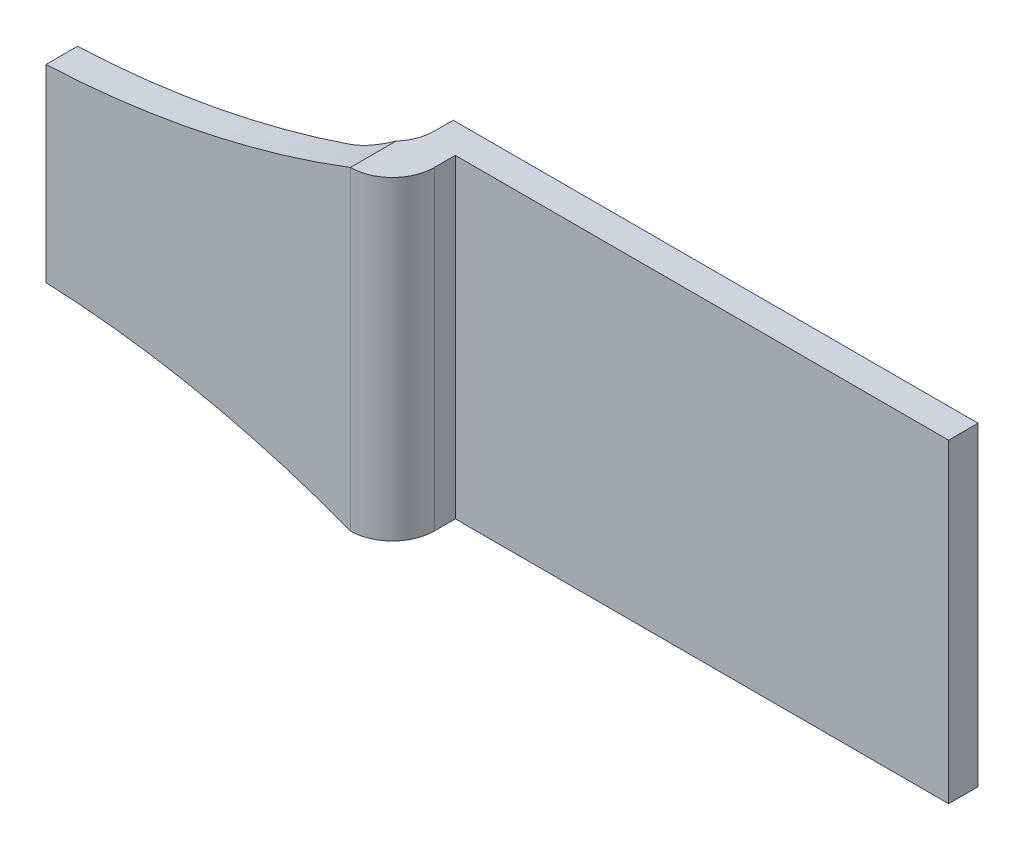
ISO-10303-21;
HEADER;
FILE_DESCRIPTION(('STEP AP214'),'2;1');
FILE_NAME('part.step','',(''),(''),'','','');
FILE_SCHEMA(('AUTOMOTIVE_DESIGN { 1 0 10303 214 1 1 1 1 }'));
ENDSEC;
DATA;
#1=APPLICATION_CONTEXT('core data for automotive mechanical design processes');
#2=APPLICATION_PROTOCOL_DEFINITION('international standard','automotive_design',2000,#1);
#3=PRODUCT_CONTEXT('',#1,'mechanical');
#4=PRODUCT('Part','Part','',(#3));
#5=PRODUCT_RELATED_PRODUCT_CATEGORY('part','',(#4));
#6=PRODUCT_DEFINITION_FORMATION('','',#4);
#7=PRODUCT_DEFINITION_CONTEXT('part definition',#1,'design');
#8=PRODUCT_DEFINITION('design','',#6,#7);
#9=PRODUCT_DEFINITION_SHAPE('','',#8);
#10=(LENGTH_UNIT() NAMED_UNIT(*) SI_UNIT(.MILLI.,.METRE.));
#11=(NAMED_UNIT(*) PLANE_ANGLE_UNIT() SI_UNIT($,.RADIAN.));
#12=(NAMED_UNIT(*) SI_UNIT($,.STERADIAN.) SOLID_ANGLE_UNIT());
#13=UNCERTAINTY_MEASURE_WITH_UNIT(LENGTH_MEASURE(1.E-05),#10,'distance_accuracy_value','');
#14=(GEOMETRIC_REPRESENTATION_CONTEXT(3) GLOBAL_UNCERTAINTY_ASSIGNED_CONTEXT((#13)) GLOBAL_UNIT_ASSIGNED_CONTEXT((#10,
#11,#12)) REPRESENTATION_CONTEXT('',''));
#15=CARTESIAN_POINT('',(0.,0.,0.));
#16=DIRECTION('',(0.,0.,1.));
#17=DIRECTION('',(1.,0.,0.));
#18=AXIS2_PLACEMENT_3D('',#15,#16,#17);
#19=CARTESIAN_POINT('',(0.,0.,1.4));
#20=DIRECTION('',(0.,0.,1.));
#21=DIRECTION('',(1.,0.,0.));
#22=AXIS2_PLACEMENT_3D('',#19,#20,#21);
#23=PLANE('',#22);
#24=DIRECTION('',(-1.,0.,0.));
#25=VECTOR('',#24,1.);
#26=CARTESIAN_POINT('',(-79.1957684576334,25.3826530612245,1.4));
#27=LINE('',#26,#25);
#28=CARTESIAN_POINT('',(-54.1957684576334,25.3826530612245,1.4));
#29=VERTEX_POINT('',#28);
#30=CARTESIAN_POINT('',(-77.6957684576334,25.3826530612245,1.4));
#31=VERTEX_POINT('',#30);
#32=EDGE_CURVE('E156',#29,#31,#27,.T.);
#33=ORIENTED_EDGE('',*,*,#32,.T.);
#34=DIRECTION('',(0.,-1.,0.));
#35=VECTOR('',#34,1.);
#36=CARTESIAN_POINT('',(-77.6957684576334,25.3826530612245,1.4));
#37=LINE('',#36,#35);
#38=CARTESIAN_POINT('',(-77.6957684576334,10.3826530612245,1.4));
#39=VERTEX_POINT('',#38);
#40=EDGE_CURVE('E142',#31,#39,#37,.T.);
#41=ORIENTED_EDGE('',*,*,#40,.T.);
#42=DIRECTION('',(1.,0.,0.));
#43=VECTOR('',#42,1.);
#44=CARTESIAN_POINT('',(-79.1957684576334,10.3826530612245,1.4));
#45=LINE('',#44,#43);
#46=CARTESIAN_POINT('',(-54.1957684576334,10.3826530612245,1.4));
#47=VERTEX_POINT('',#46);
#48=EDGE_CURVE('E151',#39,#47,#45,.T.);
#49=ORIENTED_EDGE('',*,*,#48,.T.);
#50=DIRECTION('',(0.,1.,0.));
#51=VECTOR('',#50,1.);
#52=CARTESIAN_POINT('',(-54.1957684576334,25.3826530612245,1.4));
#53=LINE('',#52,#51);
#54=EDGE_CURVE('E153',#47,#29,#53,.T.);
#55=ORIENTED_EDGE('',*,*,#54,.T.);
#56=EDGE_LOOP('',(#33,#41,#49,#55));
#57=FACE_BOUND('',#56,.T.);
#58=ADVANCED_FACE('F33',(#57),#23,.T.);
#59=CARTESIAN_POINT('',(-79.1957684576334,25.3826530612245,1.4));
#60=DIRECTION('',(1.,0.,0.));
#61=DIRECTION('',(0.,0.,-1.));
#62=AXIS2_PLACEMENT_3D('',#59,#60,#61);
#63=PLANE('',#62);
#64=DIRECTION('',(0.,0.,-1.));
#65=VECTOR('',#64,1.);
#66=CARTESIAN_POINT('',(-79.1957684576334,10.3826530612245,1.4));
#67=LINE('',#66,#65);
#68=CARTESIAN_POINT('',(-79.1957684576334,10.3826530612245,0.899999999999999));
#69=VERTEX_POINT('',#68);
#70=CARTESIAN_POINT('',(-79.1957684576334,10.3826530612245,0.));
#71=VERTEX_POINT('',#70);
#72=EDGE_CURVE('E175',#69,#71,#67,.T.);
#73=ORIENTED_EDGE('',*,*,#72,.F.);
#74=DIRECTION('',(0.,-1.,0.));
#75=VECTOR('',#74,1.);
#76=CARTESIAN_POINT('',(-79.1957684576334,25.3826530612245,0.899999999999999));
#77=LINE('',#76,#75);
#78=CARTESIAN_POINT('',(-79.1957684576334,25.3826530612245,0.899999999999999));
#79=VERTEX_POINT('',#78);
#80=EDGE_CURVE('E180',#69,#79,#77,.F.);
#81=ORIENTED_EDGE('',*,*,#80,.T.);
#82=DIRECTION('',(0.,0.,-1.));
#83=VECTOR('',#82,1.);
#84=CARTESIAN_POINT('',(-79.1957684576334,25.3826530612245,1.4));
#85=LINE('',#84,#83);
#86=CARTESIAN_POINT('',(-79.1957684576334,25.3826530612245,0.));
#87=VERTEX_POINT('',#86);
#88=EDGE_CURVE('E159',#79,#87,#85,.T.);
#89=ORIENTED_EDGE('',*,*,#88,.T.);
#90=DIRECTION('',(0.,-1.,0.));
#91=VECTOR('',#90,1.);
#92=CARTESIAN_POINT('',(-79.1957684576334,25.3826530612245,0.));
#93=LINE('',#92,#91);
#94=EDGE_CURVE('E144',#87,#71,#93,.T.);
#95=ORIENTED_EDGE('',*,*,#94,.T.);
#96=EDGE_LOOP('',(#73,#81,#89,#95));
#97=FACE_BOUND('',#96,.T.);
#98=ADVANCED_FACE('F223',(#97),#63,.F.);
#99=CARTESIAN_POINT('',(-79.1957684576334,10.3826530612245,1.4));
#100=DIRECTION('',(0.,1.,0.));
#101=DIRECTION('',(0.,0.,1.));
#102=AXIS2_PLACEMENT_3D('',#99,#100,#101);
#103=PLANE('',#102);
#104=CARTESIAN_POINT('',(-79.6957684576334,10.3826530612245,2.4));
#105=DIRECTION('',(0.,1.,0.));
#106=DIRECTION('',(0.,0.,1.));
#107=AXIS2_PLACEMENT_3D('',#104,#105,#106);
#108=CIRCLE('',#107,2.);
#109=CARTESIAN_POINT('',(-77.6957684576334,10.3826530612245,2.4));
#110=VERTEX_POINT('',#109);
#111=CARTESIAN_POINT('',(-79.6957684576334,10.3826530612245,4.4));
#112=VERTEX_POINT('',#111);
#113=EDGE_CURVE('E185',#110,#112,#108,.F.);
#114=ORIENTED_EDGE('',*,*,#113,.T.);
#115=DIRECTION('',(0.,0.,1.));
#116=VECTOR('',#115,1.);
#117=CARTESIAN_POINT('',(-79.6957684576334,10.3826530612245,0.));
#118=LINE('',#117,#116);
#119=CARTESIAN_POINT('',(-79.6957684576334,10.3826530612245,2.22287565553229));
#120=VERTEX_POINT('',#119);
#121=EDGE_CURVE('E123',#120,#112,#118,.T.);
#122=ORIENTED_EDGE('',*,*,#121,.F.);
#123=CARTESIAN_POINT('',(-81.1957684576334,10.3826530612245,0.899999999999999));
#124=DIRECTION('',(0.,1.,0.));
#125=DIRECTION('',(0.,0.,1.));
#126=AXIS2_PLACEMENT_3D('',#123,#124,#125);
#127=CIRCLE('',#126,2.);
#128=EDGE_CURVE('E191',#120,#69,#127,.T.);
#129=ORIENTED_EDGE('',*,*,#128,.T.);
#130=ORIENTED_EDGE('',*,*,#72,.T.);
#131=DIRECTION('',(1.,0.,0.));
#132=VECTOR('',#131,1.);
#133=CARTESIAN_POINT('',(-79.1957684576334,10.3826530612245,0.));
#134=LINE('',#133,#132);
#135=CARTESIAN_POINT('',(-54.1957684576334,10.3826530612245,0.));
#136=VERTEX_POINT('',#135);
#137=EDGE_CURVE('E162',#71,#136,#134,.T.);
#138=ORIENTED_EDGE('',*,*,#137,.T.);
#139=DIRECTION('',(0.,0.,-1.));
#140=VECTOR('',#139,1.);
#141=CARTESIAN_POINT('',(-54.1957684576334,10.3826530612245,1.4));
#142=LINE('',#141,#140);
#143=EDGE_CURVE('E172',#47,#136,#142,.T.);
#144=ORIENTED_EDGE('',*,*,#143,.F.);
#145=ORIENTED_EDGE('',*,*,#48,.F.);
#146=DIRECTION('',(0.,0.,1.));
#147=VECTOR('',#146,1.);
#148=CARTESIAN_POINT('',(-77.6957684576334,10.3826530612245,4.4));
#149=LINE('',#148,#147);
#150=EDGE_CURVE('E260',#39,#110,#149,.T.);
#151=ORIENTED_EDGE('',*,*,#150,.T.);
#152=EDGE_LOOP('',(#114,#122,#129,#130,#138,#144,#145,#151));
#153=FACE_BOUND('',#152,.T.);
#154=ADVANCED_FACE('F235',(#153),#103,.F.);
#155=CARTESIAN_POINT('',(-54.1957684576334,25.3826530612245,1.4));
#156=DIRECTION('',(-1.,0.,0.));
#157=DIRECTION('',(0.,-1.,0.));
#158=AXIS2_PLACEMENT_3D('',#155,#156,#157);
#159=PLANE('',#158);
#160=DIRECTION('',(0.,1.,0.));
#161=VECTOR('',#160,1.);
#162=CARTESIAN_POINT('',(-54.1957684576334,25.3826530612245,0.));
#163=LINE('',#162,#161);
#164=CARTESIAN_POINT('',(-54.1957684576334,25.3826530612245,0.));
#165=VERTEX_POINT('',#164);
#166=EDGE_CURVE('E164',#136,#165,#163,.T.);
#167=ORIENTED_EDGE('',*,*,#166,.T.);
#168=DIRECTION('',(0.,0.,-1.));
#169=VECTOR('',#168,1.);
#170=CARTESIAN_POINT('',(-54.1957684576334,25.3826530612245,1.4));
#171=LINE('',#170,#169);
#172=EDGE_CURVE('E169',#29,#165,#171,.T.);
#173=ORIENTED_EDGE('',*,*,#172,.F.);
#174=ORIENTED_EDGE('',*,*,#54,.F.);
#175=ORIENTED_EDGE('',*,*,#143,.T.);
#176=EDGE_LOOP('',(#167,#173,#174,#175));
#177=FACE_BOUND('',#176,.T.);
#178=ADVANCED_FACE('F231',(#177),#159,.F.);
#179=CARTESIAN_POINT('',(-79.1957684576334,25.3826530612245,1.4));
#180=DIRECTION('',(0.,-1.,0.));
#181=DIRECTION('',(0.,0.,-1.));
#182=AXIS2_PLACEMENT_3D('',#179,#180,#181);
#183=PLANE('',#182);
#184=CARTESIAN_POINT('',(-81.1957684576334,25.3826530612245,0.899999999999999));
#185=DIRECTION('',(0.,-1.,0.));
#186=DIRECTION('',(0.,0.,-1.));
#187=AXIS2_PLACEMENT_3D('',#184,#185,#186);
#188=CIRCLE('',#187,2.);
#189=CARTESIAN_POINT('',(-79.6957684576334,25.3826530612245,2.22287565553229));
#190=VERTEX_POINT('',#189);
#191=EDGE_CURVE('E193',#79,#190,#188,.T.);
#192=ORIENTED_EDGE('',*,*,#191,.T.);
#193=DIRECTION('',(0.,0.,1.));
#194=VECTOR('',#193,1.);
#195=CARTESIAN_POINT('',(-79.6957684576334,25.3826530612245,0.));
#196=LINE('',#195,#194);
#197=CARTESIAN_POINT('',(-79.6957684576334,25.3826530612245,4.4));
#198=VERTEX_POINT('',#197);
#199=EDGE_CURVE('E60',#190,#198,#196,.T.);
#200=ORIENTED_EDGE('',*,*,#199,.T.);
#201=CARTESIAN_POINT('',(-79.6957684576334,25.3826530612245,2.4));
#202=DIRECTION('',(0.,-1.,0.));
#203=DIRECTION('',(0.,0.,-1.));
#204=AXIS2_PLACEMENT_3D('',#201,#202,#203);
#205=CIRCLE('',#204,2.);
#206=CARTESIAN_POINT('',(-77.6957684576334,25.3826530612245,2.4));
#207=VERTEX_POINT('',#206);
#208=EDGE_CURVE('E189',#198,#207,#205,.F.);
#209=ORIENTED_EDGE('',*,*,#208,.T.);
#210=DIRECTION('',(0.,0.,1.));
#211=VECTOR('',#210,1.);
#212=CARTESIAN_POINT('',(-77.6957684576334,25.3826530612245,4.4));
#213=LINE('',#212,#211);
#214=EDGE_CURVE('E147',#31,#207,#213,.T.);
#215=ORIENTED_EDGE('',*,*,#214,.F.);
#216=ORIENTED_EDGE('',*,*,#32,.F.);
#217=ORIENTED_EDGE('',*,*,#172,.T.);
#218=DIRECTION('',(-1.,0.,0.));
#219=VECTOR('',#218,1.);
#220=CARTESIAN_POINT('',(-79.1957684576334,25.3826530612245,0.));
#221=LINE('',#220,#219);
#222=EDGE_CURVE('E154',#165,#87,#221,.T.);
#223=ORIENTED_EDGE('',*,*,#222,.T.);
#224=ORIENTED_EDGE('',*,*,#88,.F.);
#225=EDGE_LOOP('',(#192,#200,#209,#215,#216,#217,#223,#224));
#226=FACE_BOUND('',#225,.T.);
#227=ADVANCED_FACE('F227',(#226),#183,.F.);
#228=CARTESIAN_POINT('',(0.,0.,0.));
#229=DIRECTION('',(0.,0.,1.));
#230=DIRECTION('',(1.,0.,0.));
#231=AXIS2_PLACEMENT_3D('',#228,#229,#230);
#232=PLANE('',#231);
#233=ORIENTED_EDGE('',*,*,#94,.F.);
#234=ORIENTED_EDGE('',*,*,#222,.F.);
#235=ORIENTED_EDGE('',*,*,#166,.F.);
#236=ORIENTED_EDGE('',*,*,#137,.F.);
#237=EDGE_LOOP('',(#233,#234,#235,#236));
#238=FACE_BOUND('',#237,.T.);
#239=ADVANCED_FACE('F211',(#238),#232,.F.);
#240=CARTESIAN_POINT('',(-79.1957684576334,25.3826530612245,2.9));
#241=DIRECTION('',(0.,0.,-1.));
#242=DIRECTION('',(-1.,0.,0.));
#243=AXIS2_PLACEMENT_3D('',#240,#241,#242);
#244=PLANE('',#243);
#245=CARTESIAN_POINT('',(-96.1498853916561,-32.6039121198848,2.9));
#246=DIRECTION('',(0.,0.,-1.));
#247=DIRECTION('',(-1.,0.,0.));
#248=AXIS2_PLACEMENT_3D('',#245,#246,#247);
#249=CIRCLE('',#248,46.0280648099423);
#250=CARTESIAN_POINT('',(-94.1957684576334,13.3826530612245,2.9));
#251=VERTEX_POINT('',#250);
#252=CARTESIAN_POINT('',(-81.1957684576334,10.9271932746699,2.9));
#253=VERTEX_POINT('',#252);
#254=EDGE_CURVE('E53',#251,#253,#249,.T.);
#255=ORIENTED_EDGE('',*,*,#254,.F.);
#256=DIRECTION('',(0.,-1.,0.));
#257=VECTOR('',#256,1.);
#258=CARTESIAN_POINT('',(-94.1957684576334,25.3826530612245,2.9));
#259=LINE('',#258,#257);
#260=CARTESIAN_POINT('',(-94.1957684576334,22.3826530612245,2.9));
#261=VERTEX_POINT('',#260);
#262=EDGE_CURVE('E137',#261,#251,#259,.T.);
#263=ORIENTED_EDGE('',*,*,#262,.F.);
#264=CARTESIAN_POINT('',(-96.1498853916561,68.3692182423338,2.9));
#265=DIRECTION('',(0.,0.,-1.));
#266=DIRECTION('',(-1.,0.,0.));
#267=AXIS2_PLACEMENT_3D('',#264,#265,#266);
#268=CIRCLE('',#267,46.0280648099423);
#269=CARTESIAN_POINT('',(-81.1957684576334,24.8381128477791,2.9));
#270=VERTEX_POINT('',#269);
#271=EDGE_CURVE('E264',#270,#261,#268,.T.);
#272=ORIENTED_EDGE('',*,*,#271,.F.);
#273=DIRECTION('',(0.,-1.,0.));
#274=VECTOR('',#273,1.);
#275=CARTESIAN_POINT('',(-81.1957684576334,25.3826530612245,2.9));
#276=LINE('',#275,#274);
#277=EDGE_CURVE('E177',#270,#253,#276,.T.);
#278=ORIENTED_EDGE('',*,*,#277,.T.);
#279=EDGE_LOOP('',(#255,#263,#272,#278));
#280=FACE_BOUND('',#279,.T.);
#281=ADVANCED_FACE('F208',(#280),#244,.T.);
#282=CARTESIAN_POINT('',(-94.1957684576334,25.3826530612245,2.9));
#283=DIRECTION('',(-1.,0.,0.));
#284=DIRECTION('',(0.,0.,1.));
#285=AXIS2_PLACEMENT_3D('',#282,#283,#284);
#286=PLANE('',#285);
#287=DIRECTION('',(0.,0.,1.));
#288=VECTOR('',#287,1.);
#289=CARTESIAN_POINT('',(-94.1957684576334,13.3826530612245,0.));
#290=LINE('',#289,#288);
#291=CARTESIAN_POINT('',(-94.1957684576334,13.3826530612245,4.4));
#292=VERTEX_POINT('',#291);
#293=EDGE_CURVE('E121',#251,#292,#290,.T.);
#294=ORIENTED_EDGE('',*,*,#293,.T.);
#295=DIRECTION('',(0.,-1.,0.));
#296=VECTOR('',#295,1.);
#297=CARTESIAN_POINT('',(-94.1957684576334,25.3826530612245,4.4));
#298=LINE('',#297,#296);
#299=CARTESIAN_POINT('',(-94.1957684576334,22.3826530612245,4.4));
#300=VERTEX_POINT('',#299);
#301=EDGE_CURVE('E135',#300,#292,#298,.T.);
#302=ORIENTED_EDGE('',*,*,#301,.F.);
#303=DIRECTION('',(0.,0.,1.));
#304=VECTOR('',#303,1.);
#305=CARTESIAN_POINT('',(-94.1957684576334,22.3826530612245,0.));
#306=LINE('',#305,#304);
#307=EDGE_CURVE('E128',#261,#300,#306,.T.);
#308=ORIENTED_EDGE('',*,*,#307,.F.);
#309=ORIENTED_EDGE('',*,*,#262,.T.);
#310=EDGE_LOOP('',(#294,#302,#308,#309));
#311=FACE_BOUND('',#310,.T.);
#312=ADVANCED_FACE('F133',(#311),#286,.T.);
#313=CARTESIAN_POINT('',(-94.1957684576334,25.3826530612245,4.4));
#314=DIRECTION('',(0.,0.,1.));
#315=DIRECTION('',(1.,0.,0.));
#316=AXIS2_PLACEMENT_3D('',#313,#314,#315);
#317=PLANE('',#316);
#318=CARTESIAN_POINT('',(-96.1498853916561,-32.6039121198848,4.4));
#319=DIRECTION('',(0.,0.,1.));
#320=DIRECTION('',(-1.,0.,0.));
#321=AXIS2_PLACEMENT_3D('',#318,#319,#320);
#322=CIRCLE('',#321,46.0280648099423);
#323=EDGE_CURVE('E118',#112,#292,#322,.T.);
#324=ORIENTED_EDGE('',*,*,#323,.F.);
#325=DIRECTION('',(0.,-1.,0.));
#326=VECTOR('',#325,1.);
#327=CARTESIAN_POINT('',(-79.6957684576334,25.3826530612245,4.4));
#328=LINE('',#327,#326);
#329=EDGE_CURVE('E187',#112,#198,#328,.F.);
#330=ORIENTED_EDGE('',*,*,#329,.T.);
#331=CARTESIAN_POINT('',(-96.1498853916561,68.3692182423338,4.4));
#332=DIRECTION('',(0.,0.,1.));
#333=DIRECTION('',(1.,0.,0.));
#334=AXIS2_PLACEMENT_3D('',#331,#332,#333);
#335=CIRCLE('',#334,46.0280648099423);
#336=EDGE_CURVE('E141',#300,#198,#335,.T.);
#337=ORIENTED_EDGE('',*,*,#336,.F.);
#338=ORIENTED_EDGE('',*,*,#301,.T.);
#339=EDGE_LOOP('',(#324,#330,#337,#338));
#340=FACE_BOUND('',#339,.T.);
#341=ADVANCED_FACE('F140',(#340),#317,.T.);
#342=CARTESIAN_POINT('',(-77.6957684576334,25.3826530612245,4.4));
#343=DIRECTION('',(1.,0.,0.));
#344=DIRECTION('',(0.,0.,-1.));
#345=AXIS2_PLACEMENT_3D('',#342,#343,#344);
#346=PLANE('',#345);
#347=ORIENTED_EDGE('',*,*,#214,.T.);
#348=DIRECTION('',(0.,-1.,0.));
#349=VECTOR('',#348,1.);
#350=CARTESIAN_POINT('',(-77.6957684576334,25.3826530612245,2.4));
#351=LINE('',#350,#349);
#352=EDGE_CURVE('E182',#207,#110,#351,.T.);
#353=ORIENTED_EDGE('',*,*,#352,.T.);
#354=ORIENTED_EDGE('',*,*,#150,.F.);
#355=ORIENTED_EDGE('',*,*,#40,.F.);
#356=EDGE_LOOP('',(#347,#353,#354,#355));
#357=FACE_BOUND('',#356,.T.);
#358=ADVANCED_FACE('F217',(#357),#346,.T.);
#359=CARTESIAN_POINT('',(-81.1957684576334,25.3826530612245,0.899999999999999));
#360=DIRECTION('',(0.,-1.,0.));
#361=DIRECTION('',(0.,0.,-1.));
#362=AXIS2_PLACEMENT_3D('',#359,#360,#361);
#363=CYLINDRICAL_SURFACE('',#362,2.);
#364=ORIENTED_EDGE('',*,*,#128,.F.);
#365=CARTESIAN_POINT('',(-79.6957684576334,10.3826530612245,2.22287565553228));
#366=CARTESIAN_POINT('',(-79.7346330226481,10.3975294460342,2.26694193828285));
#367=CARTESIAN_POINT('',(-79.7753073612101,10.4130379190743,2.30914784547066));
#368=CARTESIAN_POINT('',(-79.8599476158883,10.4451613797071,2.38962946145418));
#369=CARTESIAN_POINT('',(-79.9039124921207,10.461776017545,2.42790640289872));
#370=CARTESIAN_POINT('',(-80.0401218432662,10.5129943795648,2.5364358918451));
#371=CARTESIAN_POINT('',(-80.1368269516102,10.5490286394186,2.60055130250982));
#372=CARTESIAN_POINT('',(-80.338920881425,10.6234837943405,2.71082337945173));
#373=CARTESIAN_POINT('',(-80.4443031533995,10.6619028840519,2.75699344294005));
#374=CARTESIAN_POINT('',(-80.6609577437128,10.7399348873041,2.83055115294397));
#375=CARTESIAN_POINT('',(-80.7722242039337,10.7795465971924,2.85795711486267));
#376=CARTESIAN_POINT('',(-80.9363189635076,10.8372336437402,2.88378592466215));
#377=CARTESIAN_POINT('',(-80.9880435203794,10.8553138221329,2.88986561679714));
#378=CARTESIAN_POINT('',(-81.0917498722025,10.8913555948633,2.89796788042467));
#379=CARTESIAN_POINT('',(-81.1437310691282,10.9093173400072,2.89999743585091));
#380=CARTESIAN_POINT('',(-81.1957684576334,10.9271932746699,2.90000000000007));
#381=B_SPLINE_CURVE_WITH_KNOTS('',3,(#365,#366,#367,#368,#369,#370,#371,#372,#373,#374,#375,
#376,#377,#378,#379,#380),.UNSPECIFIED.,.F.,.F.,(4,2,2,2,2,2,2,4),(0.,0.181702801504974,
0.363348421356718,0.72596846239695,1.08831726480036,1.45031187694297,1.6155761266121,
1.78055515248767),.UNSPECIFIED.);
#382=EDGE_CURVE('E11',#120,#253,#381,.T.);
#383=ORIENTED_EDGE('',*,*,#382,.T.);
#384=ORIENTED_EDGE('',*,*,#277,.F.);
#385=CARTESIAN_POINT('',(-81.1957684576334,24.8381128477791,2.9));
#386=CARTESIAN_POINT('',(-81.1365501874692,24.8584552181165,2.89999723238956));
#387=CARTESIAN_POINT('',(-81.077403961803,24.8789095439915,2.89736835594487));
#388=CARTESIAN_POINT('',(-80.9596069556293,24.9199136111208,2.88688958215076));
#389=CARTESIAN_POINT('',(-80.9009561916439,24.9404633555219,2.87903951138145));
#390=CARTESIAN_POINT('',(-80.7260961715384,25.0021257662265,2.84767157949539));
#391=CARTESIAN_POINT('',(-80.6111684673864,25.043186541436,2.81633617929046));
#392=CARTESIAN_POINT('',(-80.3881766585467,25.1238091884409,2.73357076475148));
#393=CARTESIAN_POINT('',(-80.28011912043,25.1633696120387,2.6821218517069));
#394=CARTESIAN_POINT('',(-80.0743476900273,25.2395089894188,2.56031125651079));
#395=CARTESIAN_POINT('',(-79.9766060722561,25.2760958707482,2.49000216583793));
#396=CARTESIAN_POINT('',(-79.8520548349827,25.3231408935146,2.38203241820639));
#397=CARTESIAN_POINT('',(-79.8193891250484,25.3355244981115,2.35174899344489));
#398=CARTESIAN_POINT('',(-79.7560572555992,25.3596113001515,2.28896114856636));
#399=CARTESIAN_POINT('',(-79.7253894606724,25.371315053221,2.25645859073953));
#400=CARTESIAN_POINT('',(-79.6957684576334,25.3826530612244,2.22287565553229));
#401=B_SPLINE_CURVE_WITH_KNOTS('',3,(#385,#386,#387,#388,#389,#390,#391,#392,#393,#394,#395,
#396,#397,#398,#399,#400),.UNSPECIFIED.,.F.,.F.,(4,2,2,2,2,2,2,4),(0.,0.18772657852227,
0.375459392620127,0.751517964389639,1.12793073434376,1.50330459880367,1.64192431144698,
1.78042909168314),.UNSPECIFIED.);
#402=EDGE_CURVE('E46',#270,#190,#401,.T.);
#403=ORIENTED_EDGE('',*,*,#402,.T.);
#404=ORIENTED_EDGE('',*,*,#191,.F.);
#405=ORIENTED_EDGE('',*,*,#80,.F.);
#406=EDGE_LOOP('',(#364,#383,#384,#403,#404,#405));
#407=FACE_BOUND('',#406,.T.);
#408=ADVANCED_FACE('F200',(#407),#363,.F.);
#409=CARTESIAN_POINT('',(-79.6957684576334,25.3826530612245,2.4));
#410=DIRECTION('',(0.,-1.,0.));
#411=DIRECTION('',(0.,0.,-1.));
#412=AXIS2_PLACEMENT_3D('',#409,#410,#411);
#413=CYLINDRICAL_SURFACE('',#412,2.);
#414=ORIENTED_EDGE('',*,*,#208,.F.);
#415=ORIENTED_EDGE('',*,*,#329,.F.);
#416=ORIENTED_EDGE('',*,*,#113,.F.);
#417=ORIENTED_EDGE('',*,*,#352,.F.);
#418=EDGE_LOOP('',(#414,#415,#416,#417));
#419=FACE_BOUND('',#418,.T.);
#420=ADVANCED_FACE('F35',(#419),#413,.T.);
#421=CARTESIAN_POINT('',(-96.1498853916561,68.3692182423338,0.));
#422=DIRECTION('',(0.,0.,1.));
#423=DIRECTION('',(1.,0.,0.));
#424=AXIS2_PLACEMENT_3D('',#421,#422,#423);
#425=CYLINDRICAL_SURFACE('',#424,46.0280648099423);
#426=ORIENTED_EDGE('',*,*,#271,.T.);
#427=ORIENTED_EDGE('',*,*,#307,.T.);
#428=ORIENTED_EDGE('',*,*,#336,.T.);
#429=ORIENTED_EDGE('',*,*,#199,.F.);
#430=ORIENTED_EDGE('',*,*,#402,.F.);
#431=EDGE_LOOP('',(#426,#427,#428,#429,#430));
#432=FACE_BOUND('',#431,.T.);
#433=ADVANCED_FACE('F203',(#432),#425,.F.);
#434=CARTESIAN_POINT('',(-96.1498853916561,-32.6039121198848,0.));
#435=DIRECTION('',(0.,0.,1.));
#436=DIRECTION('',(1.,0.,0.));
#437=AXIS2_PLACEMENT_3D('',#434,#435,#436);
#438=CYLINDRICAL_SURFACE('',#437,46.0280648099423);
#439=ORIENTED_EDGE('',*,*,#254,.T.);
#440=ORIENTED_EDGE('',*,*,#382,.F.);
#441=ORIENTED_EDGE('',*,*,#121,.T.);
#442=ORIENTED_EDGE('',*,*,#323,.T.);
#443=ORIENTED_EDGE('',*,*,#293,.F.);
#444=EDGE_LOOP('',(#439,#440,#441,#442,#443));
#445=FACE_BOUND('',#444,.T.);
#446=ADVANCED_FACE('F120',(#445),#438,.F.);
#447=CLOSED_SHELL('',(#58,#98,#154,#178,#227,#239,#281,#312,#341,#358,#408,#420,#433,#446));
#448=MANIFOLD_SOLID_BREP('B2',#447);
#449=ADVANCED_BREP_SHAPE_REPRESENTATION('',(#18,#448),#14);
#450=SHAPE_DEFINITION_REPRESENTATION(#9,#449);
ENDSEC;
END-ISO-10303-21;
